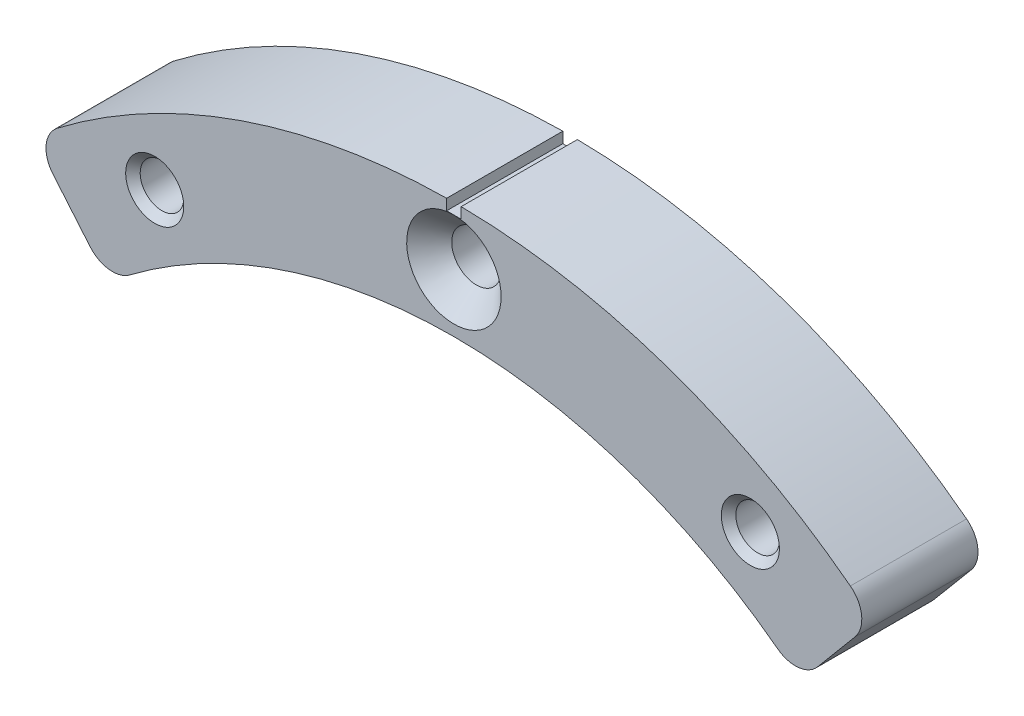
ISO-10303-21;
HEADER;
FILE_DESCRIPTION(('STEP AP214'),'2;1');
FILE_NAME('part.step','',(''),(''),'','','');
FILE_SCHEMA(('AUTOMOTIVE_DESIGN { 1 0 10303 214 1 1 1 1 }'));
ENDSEC;
DATA;
#1=APPLICATION_CONTEXT('core data for automotive mechanical design processes');
#2=APPLICATION_PROTOCOL_DEFINITION('international standard','automotive_design',2000,#1);
#3=PRODUCT_CONTEXT('',#1,'mechanical');
#4=PRODUCT('Part','Part','',(#3));
#5=PRODUCT_RELATED_PRODUCT_CATEGORY('part','',(#4));
#6=PRODUCT_DEFINITION_FORMATION('','',#4);
#7=PRODUCT_DEFINITION_CONTEXT('part definition',#1,'design');
#8=PRODUCT_DEFINITION('design','',#6,#7);
#9=PRODUCT_DEFINITION_SHAPE('','',#8);
#10=(LENGTH_UNIT() NAMED_UNIT(*) SI_UNIT(.MILLI.,.METRE.));
#11=(NAMED_UNIT(*) PLANE_ANGLE_UNIT() SI_UNIT($,.RADIAN.));
#12=(NAMED_UNIT(*) SI_UNIT($,.STERADIAN.) SOLID_ANGLE_UNIT());
#13=UNCERTAINTY_MEASURE_WITH_UNIT(LENGTH_MEASURE(1.E-05),#10,'distance_accuracy_value','');
#14=(GEOMETRIC_REPRESENTATION_CONTEXT(3) GLOBAL_UNCERTAINTY_ASSIGNED_CONTEXT((#13)) GLOBAL_UNIT_ASSIGNED_CONTEXT((#10,
#11,#12)) REPRESENTATION_CONTEXT('',''));
#15=CARTESIAN_POINT('',(0.,0.,0.));
#16=DIRECTION('',(0.,0.,1.));
#17=DIRECTION('',(1.,0.,0.));
#18=AXIS2_PLACEMENT_3D('',#15,#16,#17);
#19=CARTESIAN_POINT('',(0.,0.,8.));
#20=DIRECTION('',(0.,0.,-1.));
#21=DIRECTION('',(-1.,0.,0.));
#22=AXIS2_PLACEMENT_3D('',#19,#20,#21);
#23=CYLINDRICAL_SURFACE('',#22,45.);
#24=CARTESIAN_POINT('',(0.,0.,0.));
#25=DIRECTION('',(0.,0.,1.));
#26=DIRECTION('',(-1.,0.,0.));
#27=AXIS2_PLACEMENT_3D('',#24,#25,#26);
#28=CIRCLE('',#27,45.);
#29=CARTESIAN_POINT('',(27.2907890009069,35.780061985804,0.));
#30=VERTEX_POINT('',#29);
#31=CARTESIAN_POINT('',(0.499999999999999,44.9972221364831,0.));
#32=VERTEX_POINT('',#31);
#33=EDGE_CURVE('E224',#30,#32,#28,.T.);
#34=ORIENTED_EDGE('',*,*,#33,.T.);
#35=DIRECTION('',(0.,0.,-1.));
#36=VECTOR('',#35,1.);
#37=CARTESIAN_POINT('',(0.499999999999999,44.9972221364831,8.));
#38=LINE('',#37,#36);
#39=CARTESIAN_POINT('',(0.499999999999999,44.9972221364831,8.));
#40=VERTEX_POINT('',#39);
#41=EDGE_CURVE('E150',#32,#40,#38,.F.);
#42=ORIENTED_EDGE('',*,*,#41,.T.);
#43=CARTESIAN_POINT('',(0.,0.,8.));
#44=DIRECTION('',(0.,0.,1.));
#45=DIRECTION('',(-1.,0.,0.));
#46=AXIS2_PLACEMENT_3D('',#43,#44,#45);
#47=CIRCLE('',#46,45.);
#48=CARTESIAN_POINT('',(27.2907890009069,35.780061985804,8.));
#49=VERTEX_POINT('',#48);
#50=EDGE_CURVE('E206',#49,#40,#47,.T.);
#51=ORIENTED_EDGE('',*,*,#50,.F.);
#52=DIRECTION('',(0.,0.,-1.));
#53=VECTOR('',#52,1.);
#54=CARTESIAN_POINT('',(27.2907890009069,35.780061985804,8.));
#55=LINE('',#54,#53);
#56=EDGE_CURVE('E271',#49,#30,#55,.T.);
#57=ORIENTED_EDGE('',*,*,#56,.T.);
#58=EDGE_LOOP('',(#34,#42,#51,#57));
#59=FACE_BOUND('',#58,.T.);
#60=ADVANCED_FACE('F42',(#59),#23,.T.);
#61=CARTESIAN_POINT('',(0.,0.,8.));
#62=DIRECTION('',(0.,0.,-1.));
#63=DIRECTION('',(-1.,0.,0.));
#64=AXIS2_PLACEMENT_3D('',#61,#62,#63);
#65=CYLINDRICAL_SURFACE('',#64,37.);
#66=CARTESIAN_POINT('',(0.,0.,8.));
#67=DIRECTION('',(0.,0.,-1.));
#68=DIRECTION('',(-1.,0.,0.));
#69=AXIS2_PLACEMENT_3D('',#66,#67,#68);
#70=CIRCLE('',#69,37.);
#71=CARTESIAN_POINT('',(-22.2983277121293,29.5259983953547,8.));
#72=VERTEX_POINT('',#71);
#73=CARTESIAN_POINT('',(22.2983277121295,29.5259983953545,8.));
#74=VERTEX_POINT('',#73);
#75=EDGE_CURVE('E197',#72,#74,#70,.T.);
#76=ORIENTED_EDGE('',*,*,#75,.F.);
#77=DIRECTION('',(0.,0.,-1.));
#78=VECTOR('',#77,1.);
#79=CARTESIAN_POINT('',(-22.2983277121293,29.5259983953547,8.));
#80=LINE('',#79,#78);
#81=CARTESIAN_POINT('',(-22.2983277121293,29.5259983953547,0.));
#82=VERTEX_POINT('',#81);
#83=EDGE_CURVE('E235',#72,#82,#80,.T.);
#84=ORIENTED_EDGE('',*,*,#83,.T.);
#85=CARTESIAN_POINT('',(0.,0.,0.));
#86=DIRECTION('',(0.,0.,-1.));
#87=DIRECTION('',(-1.,0.,0.));
#88=AXIS2_PLACEMENT_3D('',#85,#86,#87);
#89=CIRCLE('',#88,37.);
#90=CARTESIAN_POINT('',(22.2983277121295,29.5259983953545,0.));
#91=VERTEX_POINT('',#90);
#92=EDGE_CURVE('E215',#82,#91,#89,.T.);
#93=ORIENTED_EDGE('',*,*,#92,.T.);
#94=DIRECTION('',(0.,0.,-1.));
#95=VECTOR('',#94,1.);
#96=CARTESIAN_POINT('',(22.2983277121295,29.5259983953545,8.));
#97=LINE('',#96,#95);
#98=EDGE_CURVE('E214',#91,#74,#97,.F.);
#99=ORIENTED_EDGE('',*,*,#98,.T.);
#100=EDGE_LOOP('',(#76,#84,#93,#99));
#101=FACE_BOUND('',#100,.T.);
#102=ADVANCED_FACE('F316',(#101),#65,.F.);
#103=CARTESIAN_POINT('',(23.783141558402,28.3436443954022,8.));
#104=DIRECTION('',(-0.766044443118977,0.64278760968654,0.));
#105=DIRECTION('',(-0.642787609686541,-0.766044443118977,0.));
#106=AXIS2_PLACEMENT_3D('',#103,#104,#105);
#107=PLANE('',#106);
#108=DIRECTION('',(0.642787609686541,0.766044443118977,0.));
#109=VECTOR('',#108,1.);
#110=CARTESIAN_POINT('',(23.783141558402,28.3436443954022,0.));
#111=LINE('',#110,#109);
#112=CARTESIAN_POINT('',(25.0357316098339,29.8364230892439,0.));
#113=VERTEX_POINT('',#112);
#114=CARTESIAN_POINT('',(27.609953931549,32.9042617892841,0.));
#115=VERTEX_POINT('',#114);
#116=EDGE_CURVE('E219',#113,#115,#111,.T.);
#117=ORIENTED_EDGE('',*,*,#116,.T.);
#118=DIRECTION('',(0.,0.,-1.));
#119=VECTOR('',#118,1.);
#120=CARTESIAN_POINT('',(27.609953931549,32.9042617892841,8.));
#121=LINE('',#120,#119);
#122=CARTESIAN_POINT('',(27.609953931549,32.9042617892841,8.));
#123=VERTEX_POINT('',#122);
#124=EDGE_CURVE('E282',#115,#123,#121,.F.);
#125=ORIENTED_EDGE('',*,*,#124,.T.);
#126=DIRECTION('',(0.642787609686541,0.766044443118977,0.));
#127=VECTOR('',#126,1.);
#128=CARTESIAN_POINT('',(23.783141558402,28.3436443954022,8.));
#129=LINE('',#128,#127);
#130=CARTESIAN_POINT('',(25.0357316098339,29.8364230892439,8.));
#131=VERTEX_POINT('',#130);
#132=EDGE_CURVE('E201',#131,#123,#129,.T.);
#133=ORIENTED_EDGE('',*,*,#132,.F.);
#134=DIRECTION('',(0.,0.,-1.));
#135=VECTOR('',#134,1.);
#136=CARTESIAN_POINT('',(25.0357316098339,29.8364230892439,8.));
#137=LINE('',#136,#135);
#138=EDGE_CURVE('E278',#131,#113,#137,.T.);
#139=ORIENTED_EDGE('',*,*,#138,.T.);
#140=EDGE_LOOP('',(#117,#125,#133,#139));
#141=FACE_BOUND('',#140,.T.);
#142=ADVANCED_FACE('F323',(#141),#107,.F.);
#143=CARTESIAN_POINT('',(-0.500000000000001,44.9972221364831,8.));
#144=VERTEX_POINT('',#143);
#145=CARTESIAN_POINT('',(-27.2907890009067,35.7800619858042,8.));
#146=VERTEX_POINT('',#145);
#147=EDGE_CURVE('E67',#144,#146,#47,.T.);
#148=ORIENTED_EDGE('',*,*,#147,.F.);
#149=DIRECTION('',(0.,0.,-1.));
#150=VECTOR('',#149,1.);
#151=CARTESIAN_POINT('',(-0.500000000000001,44.9972221364831,8.));
#152=LINE('',#151,#150);
#153=CARTESIAN_POINT('',(-0.500000000000001,44.9972221364831,0.));
#154=VERTEX_POINT('',#153);
#155=EDGE_CURVE('E143',#144,#154,#152,.T.);
#156=ORIENTED_EDGE('',*,*,#155,.T.);
#157=CARTESIAN_POINT('',(-27.2907890009067,35.7800619858042,0.));
#158=VERTEX_POINT('',#157);
#159=EDGE_CURVE('E223',#154,#158,#28,.T.);
#160=ORIENTED_EDGE('',*,*,#159,.T.);
#161=DIRECTION('',(0.,0.,-1.));
#162=VECTOR('',#161,1.);
#163=CARTESIAN_POINT('',(-27.2907890009067,35.7800619858042,8.));
#164=LINE('',#163,#162);
#165=EDGE_CURVE('E275',#158,#146,#164,.F.);
#166=ORIENTED_EDGE('',*,*,#165,.T.);
#167=EDGE_LOOP('',(#148,#156,#160,#166));
#168=FACE_BOUND('',#167,.T.);
#169=ADVANCED_FACE('F319',(#168),#23,.T.);
#170=CARTESIAN_POINT('',(-28.9254424358941,34.4719999403542,8.));
#171=DIRECTION('',(0.766044443118982,0.642787609686535,0.));
#172=DIRECTION('',(-0.642787609686535,0.766044443118982,0.));
#173=AXIS2_PLACEMENT_3D('',#170,#171,#172);
#174=PLANE('',#173);
#175=DIRECTION('',(0.642787609686535,-0.766044443118982,0.));
#176=VECTOR('',#175,1.);
#177=CARTESIAN_POINT('',(-28.9254424358941,34.4719999403542,0.));
#178=LINE('',#177,#176);
#179=CARTESIAN_POINT('',(-27.6099539315488,32.9042617892843,0.));
#180=VERTEX_POINT('',#179);
#181=CARTESIAN_POINT('',(-25.0357316098337,29.836423089244,0.));
#182=VERTEX_POINT('',#181);
#183=EDGE_CURVE('E202',#180,#182,#178,.T.);
#184=ORIENTED_EDGE('',*,*,#183,.T.);
#185=DIRECTION('',(0.,0.,-1.));
#186=VECTOR('',#185,1.);
#187=CARTESIAN_POINT('',(-25.0357316098337,29.836423089244,8.));
#188=LINE('',#187,#186);
#189=CARTESIAN_POINT('',(-25.0357316098337,29.836423089244,8.));
#190=VERTEX_POINT('',#189);
#191=EDGE_CURVE('E256',#182,#190,#188,.F.);
#192=ORIENTED_EDGE('',*,*,#191,.T.);
#193=DIRECTION('',(0.642787609686535,-0.766044443118982,0.));
#194=VECTOR('',#193,1.);
#195=CARTESIAN_POINT('',(-28.9254424358941,34.4719999403542,8.));
#196=LINE('',#195,#194);
#197=CARTESIAN_POINT('',(-27.6099539315488,32.9042617892843,8.));
#198=VERTEX_POINT('',#197);
#199=EDGE_CURVE('E210',#198,#190,#196,.T.);
#200=ORIENTED_EDGE('',*,*,#199,.F.);
#201=DIRECTION('',(0.,0.,-1.));
#202=VECTOR('',#201,1.);
#203=CARTESIAN_POINT('',(-27.6099539315488,32.9042617892843,8.));
#204=LINE('',#203,#202);
#205=EDGE_CURVE('E252',#198,#180,#204,.T.);
#206=ORIENTED_EDGE('',*,*,#205,.T.);
#207=EDGE_LOOP('',(#184,#192,#200,#206));
#208=FACE_BOUND('',#207,.T.);
#209=ADVANCED_FACE('F329',(#208),#174,.F.);
#210=CARTESIAN_POINT('',(0.,0.,8.));
#211=DIRECTION('',(0.,0.,-1.));
#212=DIRECTION('',(-1.,0.,0.));
#213=AXIS2_PLACEMENT_3D('',#210,#211,#212);
#214=PLANE('',#213);
#215=CARTESIAN_POINT('',(20.4069726364171,35.5605886877105,8.));
#216=DIRECTION('',(0.,0.,-1.));
#217=DIRECTION('',(-1.,0.,0.));
#218=AXIS2_PLACEMENT_3D('',#215,#216,#217);
#219=CIRCLE('',#218,1.99999999999998);
#220=CARTESIAN_POINT('',(18.4069726364172,35.5605886877105,8.));
#221=VERTEX_POINT('',#220);
#222=EDGE_CURVE('E293',#221,#221,#219,.T.);
#223=ORIENTED_EDGE('',*,*,#222,.T.);
#224=EDGE_LOOP('',(#223));
#225=FACE_BOUND('',#224,.T.);
#226=CARTESIAN_POINT('',(-20.5928868588783,35.4532510613263,8.));
#227=DIRECTION('',(0.,0.,-1.));
#228=DIRECTION('',(-1.,0.,0.));
#229=AXIS2_PLACEMENT_3D('',#226,#227,#228);
#230=CIRCLE('',#229,1.99999999999997);
#231=CARTESIAN_POINT('',(-22.5928868588783,35.4532510613263,8.));
#232=VERTEX_POINT('',#231);
#233=EDGE_CURVE('E289',#232,#232,#230,.T.);
#234=ORIENTED_EDGE('',*,*,#233,.T.);
#235=EDGE_LOOP('',(#234));
#236=FACE_BOUND('',#235,.T.);
#237=ORIENTED_EDGE('',*,*,#50,.T.);
#238=DIRECTION('',(0.,1.,0.));
#239=VECTOR('',#238,1.);
#240=CARTESIAN_POINT('',(0.499999999999999,45.75,8.));
#241=LINE('',#240,#239);
#242=CARTESIAN_POINT('',(0.499999999999999,44.25,8.));
#243=VERTEX_POINT('',#242);
#244=EDGE_CURVE('E167',#243,#40,#241,.T.);
#245=ORIENTED_EDGE('',*,*,#244,.F.);
#246=DIRECTION('',(1.,0.,0.));
#247=VECTOR('',#246,1.);
#248=CARTESIAN_POINT('',(-0.500000000000001,44.25,8.));
#249=LINE('',#248,#247);
#250=CARTESIAN_POINT('',(0.,44.25,8.));
#251=VERTEX_POINT('',#250);
#252=EDGE_CURVE('E139',#251,#243,#249,.T.);
#253=ORIENTED_EDGE('',*,*,#252,.F.);
#254=CARTESIAN_POINT('',(0.,41.,8.));
#255=DIRECTION('',(0.,0.,1.));
#256=DIRECTION('',(1.,0.,0.));
#257=AXIS2_PLACEMENT_3D('',#254,#255,#256);
#258=CIRCLE('',#257,3.25);
#259=EDGE_CURVE('E188',#251,#251,#258,.T.);
#260=ORIENTED_EDGE('',*,*,#259,.F.);
#261=CARTESIAN_POINT('',(-0.500000000000001,44.25,8.));
#262=VERTEX_POINT('',#261);
#263=EDGE_CURVE('E155',#262,#251,#249,.T.);
#264=ORIENTED_EDGE('',*,*,#263,.F.);
#265=DIRECTION('',(0.,-1.,0.));
#266=VECTOR('',#265,1.);
#267=CARTESIAN_POINT('',(-0.500000000000001,45.75,8.));
#268=LINE('',#267,#266);
#269=EDGE_CURVE('E170',#144,#262,#268,.T.);
#270=ORIENTED_EDGE('',*,*,#269,.F.);
#271=ORIENTED_EDGE('',*,*,#147,.T.);
#272=CARTESIAN_POINT('',(-26.0778650453108,34.1898370086573,8.));
#273=DIRECTION('',(0.,0.,-1.));
#274=DIRECTION('',(-1.,0.,0.));
#275=AXIS2_PLACEMENT_3D('',#272,#273,#274);
#276=CIRCLE('',#275,2.);
#277=EDGE_CURVE('E265',#146,#198,#276,.F.);
#278=ORIENTED_EDGE('',*,*,#277,.T.);
#279=ORIENTED_EDGE('',*,*,#199,.T.);
#280=CARTESIAN_POINT('',(-23.5036427235957,31.1219983086171,8.));
#281=DIRECTION('',(0.,0.,-1.));
#282=DIRECTION('',(-1.,0.,0.));
#283=AXIS2_PLACEMENT_3D('',#280,#281,#282);
#284=CIRCLE('',#283,2.);
#285=EDGE_CURVE('E268',#190,#72,#284,.F.);
#286=ORIENTED_EDGE('',*,*,#285,.T.);
#287=ORIENTED_EDGE('',*,*,#75,.T.);
#288=CARTESIAN_POINT('',(23.5036427235959,31.1219983086169,8.));
#289=DIRECTION('',(0.,0.,-1.));
#290=DIRECTION('',(-1.,0.,0.));
#291=AXIS2_PLACEMENT_3D('',#288,#289,#290);
#292=CIRCLE('',#291,2.);
#293=EDGE_CURVE('E259',#74,#131,#292,.F.);
#294=ORIENTED_EDGE('',*,*,#293,.T.);
#295=ORIENTED_EDGE('',*,*,#132,.T.);
#296=CARTESIAN_POINT('',(26.0778650453111,34.1898370086572,8.));
#297=DIRECTION('',(0.,0.,-1.));
#298=DIRECTION('',(-1.,0.,0.));
#299=AXIS2_PLACEMENT_3D('',#296,#297,#298);
#300=CIRCLE('',#299,2.);
#301=EDGE_CURVE('E262',#123,#49,#300,.F.);
#302=ORIENTED_EDGE('',*,*,#301,.T.);
#303=EDGE_LOOP('',(#237,#245,#253,#260,#264,#270,#271,#278,#279,#286,#287,#294,#295,#302));
#304=FACE_BOUND('',#303,.T.);
#305=ADVANCED_FACE('F335',(#225,#236,#304),#214,.F.);
#306=CARTESIAN_POINT('',(0.,0.,0.));
#307=DIRECTION('',(0.,0.,-1.));
#308=DIRECTION('',(-1.,0.,0.));
#309=AXIS2_PLACEMENT_3D('',#306,#307,#308);
#310=PLANE('',#309);
#311=DIRECTION('',(0.,1.,0.));
#312=VECTOR('',#311,1.);
#313=CARTESIAN_POINT('',(0.499999999999999,45.75,0.));
#314=LINE('',#313,#312);
#315=CARTESIAN_POINT('',(0.499999999999999,44.25,0.));
#316=VERTEX_POINT('',#315);
#317=EDGE_CURVE('E147',#316,#32,#314,.T.);
#318=ORIENTED_EDGE('',*,*,#317,.T.);
#319=ORIENTED_EDGE('',*,*,#33,.F.);
#320=CARTESIAN_POINT('',(26.0778650453111,34.1898370086572,0.));
#321=DIRECTION('',(0.,0.,-1.));
#322=DIRECTION('',(-1.,0.,0.));
#323=AXIS2_PLACEMENT_3D('',#320,#321,#322);
#324=CIRCLE('',#323,2.);
#325=EDGE_CURVE('E242',#30,#115,#324,.T.);
#326=ORIENTED_EDGE('',*,*,#325,.T.);
#327=ORIENTED_EDGE('',*,*,#116,.F.);
#328=CARTESIAN_POINT('',(23.5036427235959,31.1219983086169,0.));
#329=DIRECTION('',(0.,0.,-1.));
#330=DIRECTION('',(-1.,0.,0.));
#331=AXIS2_PLACEMENT_3D('',#328,#329,#330);
#332=CIRCLE('',#331,2.);
#333=EDGE_CURVE('E239',#113,#91,#332,.T.);
#334=ORIENTED_EDGE('',*,*,#333,.T.);
#335=ORIENTED_EDGE('',*,*,#92,.F.);
#336=CARTESIAN_POINT('',(-23.5036427235957,31.1219983086171,0.));
#337=DIRECTION('',(0.,0.,-1.));
#338=DIRECTION('',(-1.,0.,0.));
#339=AXIS2_PLACEMENT_3D('',#336,#337,#338);
#340=CIRCLE('',#339,2.);
#341=EDGE_CURVE('E249',#82,#182,#340,.T.);
#342=ORIENTED_EDGE('',*,*,#341,.T.);
#343=ORIENTED_EDGE('',*,*,#183,.F.);
#344=CARTESIAN_POINT('',(-26.0778650453108,34.1898370086573,0.));
#345=DIRECTION('',(0.,0.,-1.));
#346=DIRECTION('',(-1.,0.,0.));
#347=AXIS2_PLACEMENT_3D('',#344,#345,#346);
#348=CIRCLE('',#347,2.);
#349=EDGE_CURVE('E245',#180,#158,#348,.T.);
#350=ORIENTED_EDGE('',*,*,#349,.T.);
#351=ORIENTED_EDGE('',*,*,#159,.F.);
#352=DIRECTION('',(0.,1.,0.));
#353=VECTOR('',#352,1.);
#354=CARTESIAN_POINT('',(-0.499999999999995,0.,0.));
#355=LINE('',#354,#353);
#356=CARTESIAN_POINT('',(-0.500000000000001,44.25,0.));
#357=VERTEX_POINT('',#356);
#358=EDGE_CURVE('E11',#357,#154,#355,.T.);
#359=ORIENTED_EDGE('',*,*,#358,.F.);
#360=DIRECTION('',(1.,0.,0.));
#361=VECTOR('',#360,1.);
#362=CARTESIAN_POINT('',(-0.500000000000001,44.25,0.));
#363=LINE('',#362,#361);
#364=EDGE_CURVE('E59',#357,#316,#363,.T.);
#365=ORIENTED_EDGE('',*,*,#364,.T.);
#366=EDGE_LOOP('',(#318,#319,#326,#327,#334,#335,#342,#343,#350,#351,#359,#365));
#367=FACE_BOUND('',#366,.T.);
#368=CARTESIAN_POINT('',(-20.5928868588783,35.4532510613263,0.));
#369=DIRECTION('',(0.,0.,1.));
#370=DIRECTION('',(1.,0.,0.));
#371=AXIS2_PLACEMENT_3D('',#368,#369,#370);
#372=CIRCLE('',#371,1.49999999999999);
#373=CARTESIAN_POINT('',(-19.0928868588783,35.4532510613263,0.));
#374=VERTEX_POINT('',#373);
#375=EDGE_CURVE('E180',#374,#374,#372,.T.);
#376=ORIENTED_EDGE('',*,*,#375,.T.);
#377=EDGE_LOOP('',(#376));
#378=FACE_BOUND('',#377,.T.);
#379=CARTESIAN_POINT('',(20.4069726364171,35.5605886877105,0.));
#380=DIRECTION('',(0.,0.,1.));
#381=DIRECTION('',(1.,0.,0.));
#382=AXIS2_PLACEMENT_3D('',#379,#380,#381);
#383=CIRCLE('',#382,1.49999999999999);
#384=CARTESIAN_POINT('',(21.9069726364171,35.5605886877105,0.));
#385=VERTEX_POINT('',#384);
#386=EDGE_CURVE('E184',#385,#385,#383,.T.);
#387=ORIENTED_EDGE('',*,*,#386,.T.);
#388=EDGE_LOOP('',(#387));
#389=FACE_BOUND('',#388,.T.);
#390=CARTESIAN_POINT('',(0.,41.,0.));
#391=DIRECTION('',(0.,0.,-1.));
#392=DIRECTION('',(-1.,0.,0.));
#393=AXIS2_PLACEMENT_3D('',#390,#391,#392);
#394=CIRCLE('',#393,1.7);
#395=CARTESIAN_POINT('',(-1.7,41.,0.));
#396=VERTEX_POINT('',#395);
#397=EDGE_CURVE('E196',#396,#396,#394,.T.);
#398=ORIENTED_EDGE('',*,*,#397,.F.);
#399=EDGE_LOOP('',(#398));
#400=FACE_BOUND('',#399,.T.);
#401=ADVANCED_FACE('F158',(#367,#378,#389,#400),#310,.T.);
#402=CARTESIAN_POINT('',(0.,41.,8.));
#403=DIRECTION('',(0.,0.,1.));
#404=DIRECTION('',(1.,0.,0.));
#405=AXIS2_PLACEMENT_3D('',#402,#403,#404);
#406=CYLINDRICAL_SURFACE('',#405,1.7);
#407=ORIENTED_EDGE('',*,*,#397,.T.);
#408=EDGE_LOOP('',(#407));
#409=FACE_BOUND('',#408,.T.);
#410=CARTESIAN_POINT('',(0.,41.,6.45));
#411=DIRECTION('',(0.,0.,1.));
#412=DIRECTION('',(1.,0.,0.));
#413=AXIS2_PLACEMENT_3D('',#410,#411,#412);
#414=CIRCLE('',#413,1.7);
#415=CARTESIAN_POINT('',(1.7,41.,6.45));
#416=VERTEX_POINT('',#415);
#417=EDGE_CURVE('E192',#416,#416,#414,.T.);
#418=ORIENTED_EDGE('',*,*,#417,.T.);
#419=EDGE_LOOP('',(#418));
#420=FACE_BOUND('',#419,.T.);
#421=ADVANCED_FACE('F382',(#409,#420),#406,.F.);
#422=CARTESIAN_POINT('',(0.,41.,8.));
#423=DIRECTION('',(0.,0.,1.));
#424=DIRECTION('',(1.,0.,0.));
#425=AXIS2_PLACEMENT_3D('',#422,#423,#424);
#426=CONICAL_SURFACE('',#425,3.25,0.785398163397449);
#427=ORIENTED_EDGE('',*,*,#417,.F.);
#428=EDGE_LOOP('',(#427));
#429=FACE_BOUND('',#428,.T.);
#430=ORIENTED_EDGE('',*,*,#259,.T.);
#431=EDGE_LOOP('',(#430));
#432=FACE_BOUND('',#431,.T.);
#433=ADVANCED_FACE('F380',(#429,#432),#426,.F.);
#434=CARTESIAN_POINT('',(-23.5036427235957,31.1219983086171,8.));
#435=DIRECTION('',(0.,0.,-1.));
#436=DIRECTION('',(-1.,0.,0.));
#437=AXIS2_PLACEMENT_3D('',#434,#435,#436);
#438=CYLINDRICAL_SURFACE('',#437,2.);
#439=ORIENTED_EDGE('',*,*,#285,.F.);
#440=ORIENTED_EDGE('',*,*,#191,.F.);
#441=ORIENTED_EDGE('',*,*,#341,.F.);
#442=ORIENTED_EDGE('',*,*,#83,.F.);
#443=EDGE_LOOP('',(#439,#440,#441,#442));
#444=FACE_BOUND('',#443,.T.);
#445=ADVANCED_FACE('F359',(#444),#438,.T.);
#446=CARTESIAN_POINT('',(-26.0778650453108,34.1898370086573,8.));
#447=DIRECTION('',(0.,0.,-1.));
#448=DIRECTION('',(-1.,0.,0.));
#449=AXIS2_PLACEMENT_3D('',#446,#447,#448);
#450=CYLINDRICAL_SURFACE('',#449,2.);
#451=ORIENTED_EDGE('',*,*,#277,.F.);
#452=ORIENTED_EDGE('',*,*,#165,.F.);
#453=ORIENTED_EDGE('',*,*,#349,.F.);
#454=ORIENTED_EDGE('',*,*,#205,.F.);
#455=EDGE_LOOP('',(#451,#452,#453,#454));
#456=FACE_BOUND('',#455,.T.);
#457=ADVANCED_FACE('F354',(#456),#450,.T.);
#458=CARTESIAN_POINT('',(26.0778650453111,34.1898370086572,8.));
#459=DIRECTION('',(0.,0.,-1.));
#460=DIRECTION('',(-1.,0.,0.));
#461=AXIS2_PLACEMENT_3D('',#458,#459,#460);
#462=CYLINDRICAL_SURFACE('',#461,2.);
#463=ORIENTED_EDGE('',*,*,#301,.F.);
#464=ORIENTED_EDGE('',*,*,#124,.F.);
#465=ORIENTED_EDGE('',*,*,#325,.F.);
#466=ORIENTED_EDGE('',*,*,#56,.F.);
#467=EDGE_LOOP('',(#463,#464,#465,#466));
#468=FACE_BOUND('',#467,.T.);
#469=ADVANCED_FACE('F373',(#468),#462,.T.);
#470=CARTESIAN_POINT('',(23.5036427235959,31.1219983086169,8.));
#471=DIRECTION('',(0.,0.,-1.));
#472=DIRECTION('',(-1.,0.,0.));
#473=AXIS2_PLACEMENT_3D('',#470,#471,#472);
#474=CYLINDRICAL_SURFACE('',#473,2.);
#475=ORIENTED_EDGE('',*,*,#293,.F.);
#476=ORIENTED_EDGE('',*,*,#98,.F.);
#477=ORIENTED_EDGE('',*,*,#333,.F.);
#478=ORIENTED_EDGE('',*,*,#138,.F.);
#479=EDGE_LOOP('',(#475,#476,#477,#478));
#480=FACE_BOUND('',#479,.T.);
#481=ADVANCED_FACE('F366',(#480),#474,.T.);
#482=CARTESIAN_POINT('',(20.4069726364171,35.5605886877105,8.));
#483=DIRECTION('',(0.,0.,1.));
#484=DIRECTION('',(1.,0.,0.));
#485=AXIS2_PLACEMENT_3D('',#482,#483,#484);
#486=CYLINDRICAL_SURFACE('',#485,1.49999999999999);
#487=CARTESIAN_POINT('',(20.4069726364171,35.5605886877105,7.50000000000001));
#488=DIRECTION('',(0.,0.,-1.));
#489=DIRECTION('',(-1.,0.,0.));
#490=AXIS2_PLACEMENT_3D('',#487,#488,#489);
#491=CIRCLE('',#490,1.49999999999999);
#492=CARTESIAN_POINT('',(18.9069726364172,35.5605886877105,7.50000000000001));
#493=VERTEX_POINT('',#492);
#494=EDGE_CURVE('E285',#493,#493,#491,.F.);
#495=ORIENTED_EDGE('',*,*,#494,.T.);
#496=EDGE_LOOP('',(#495));
#497=FACE_BOUND('',#496,.T.);
#498=ORIENTED_EDGE('',*,*,#386,.F.);
#499=EDGE_LOOP('',(#498));
#500=FACE_BOUND('',#499,.T.);
#501=ADVANCED_FACE('F394',(#497,#500),#486,.F.);
#502=CARTESIAN_POINT('',(-20.5928868588783,35.4532510613263,8.));
#503=DIRECTION('',(0.,0.,1.));
#504=DIRECTION('',(1.,0.,0.));
#505=AXIS2_PLACEMENT_3D('',#502,#503,#504);
#506=CYLINDRICAL_SURFACE('',#505,1.49999999999999);
#507=CARTESIAN_POINT('',(-20.5928868588783,35.4532510613263,7.50000000000002));
#508=DIRECTION('',(0.,0.,-1.));
#509=DIRECTION('',(-1.,0.,0.));
#510=AXIS2_PLACEMENT_3D('',#507,#508,#509);
#511=CIRCLE('',#510,1.49999999999999);
#512=CARTESIAN_POINT('',(-22.0928868588783,35.4532510613263,7.50000000000002));
#513=VERTEX_POINT('',#512);
#514=EDGE_CURVE('E52',#513,#513,#511,.F.);
#515=ORIENTED_EDGE('',*,*,#514,.T.);
#516=EDGE_LOOP('',(#515));
#517=FACE_BOUND('',#516,.T.);
#518=ORIENTED_EDGE('',*,*,#375,.F.);
#519=EDGE_LOOP('',(#518));
#520=FACE_BOUND('',#519,.T.);
#521=ADVANCED_FACE('F301',(#517,#520),#506,.F.);
#522=CARTESIAN_POINT('',(20.4069726364171,35.5605886877105,7.50000000000001));
#523=DIRECTION('',(0.,0.,1.));
#524=DIRECTION('',(1.,0.,0.));
#525=AXIS2_PLACEMENT_3D('',#522,#523,#524);
#526=CONICAL_SURFACE('',#525,1.49999999999999,0.78539816339745);
#527=ORIENTED_EDGE('',*,*,#222,.F.);
#528=EDGE_LOOP('',(#527));
#529=FACE_BOUND('',#528,.T.);
#530=ORIENTED_EDGE('',*,*,#494,.F.);
#531=EDGE_LOOP('',(#530));
#532=FACE_BOUND('',#531,.T.);
#533=ADVANCED_FACE('F305',(#529,#532),#526,.F.);
#534=CARTESIAN_POINT('',(-20.5928868588783,35.4532510613263,7.50000000000002));
#535=DIRECTION('',(0.,0.,1.));
#536=DIRECTION('',(1.,0.,0.));
#537=AXIS2_PLACEMENT_3D('',#534,#535,#536);
#538=CONICAL_SURFACE('',#537,1.49999999999999,0.78539816339745);
#539=ORIENTED_EDGE('',*,*,#233,.F.);
#540=EDGE_LOOP('',(#539));
#541=FACE_BOUND('',#540,.T.);
#542=ORIENTED_EDGE('',*,*,#514,.F.);
#543=EDGE_LOOP('',(#542));
#544=FACE_BOUND('',#543,.T.);
#545=ADVANCED_FACE('F45',(#541,#544),#538,.F.);
#546=CARTESIAN_POINT('',(0.499999999999999,45.75,0.));
#547=DIRECTION('',(1.,0.,0.));
#548=DIRECTION('',(0.,1.,0.));
#549=AXIS2_PLACEMENT_3D('',#546,#547,#548);
#550=PLANE('',#549);
#551=ORIENTED_EDGE('',*,*,#317,.F.);
#552=DIRECTION('',(0.,0.,1.));
#553=VECTOR('',#552,1.);
#554=CARTESIAN_POINT('',(0.499999999999999,44.25,0.));
#555=LINE('',#554,#553);
#556=EDGE_CURVE('E135',#316,#243,#555,.T.);
#557=ORIENTED_EDGE('',*,*,#556,.T.);
#558=ORIENTED_EDGE('',*,*,#244,.T.);
#559=ORIENTED_EDGE('',*,*,#41,.F.);
#560=EDGE_LOOP('',(#551,#557,#558,#559));
#561=FACE_BOUND('',#560,.T.);
#562=ADVANCED_FACE('F148',(#561),#550,.F.);
#563=CARTESIAN_POINT('',(-0.500000000000001,45.75,0.));
#564=DIRECTION('',(-1.,0.,0.));
#565=DIRECTION('',(0.,-1.,0.));
#566=AXIS2_PLACEMENT_3D('',#563,#564,#565);
#567=PLANE('',#566);
#568=ORIENTED_EDGE('',*,*,#269,.T.);
#569=DIRECTION('',(0.,0.,1.));
#570=VECTOR('',#569,1.);
#571=CARTESIAN_POINT('',(-0.500000000000001,44.25,0.));
#572=LINE('',#571,#570);
#573=EDGE_CURVE('E144',#357,#262,#572,.T.);
#574=ORIENTED_EDGE('',*,*,#573,.F.);
#575=ORIENTED_EDGE('',*,*,#358,.T.);
#576=ORIENTED_EDGE('',*,*,#155,.F.);
#577=EDGE_LOOP('',(#568,#574,#575,#576));
#578=FACE_BOUND('',#577,.T.);
#579=ADVANCED_FACE('F311',(#578),#567,.F.);
#580=CARTESIAN_POINT('',(-0.500000000000001,44.25,0.));
#581=DIRECTION('',(0.,-1.,0.));
#582=DIRECTION('',(0.,0.,-1.));
#583=AXIS2_PLACEMENT_3D('',#580,#581,#582);
#584=PLANE('',#583);
#585=ORIENTED_EDGE('',*,*,#263,.T.);
#586=ORIENTED_EDGE('',*,*,#252,.T.);
#587=ORIENTED_EDGE('',*,*,#556,.F.);
#588=ORIENTED_EDGE('',*,*,#364,.F.);
#589=ORIENTED_EDGE('',*,*,#573,.T.);
#590=EDGE_LOOP('',(#585,#586,#587,#588,#589));
#591=FACE_BOUND('',#590,.T.);
#592=ADVANCED_FACE('F137',(#591),#584,.F.);
#593=CLOSED_SHELL('',(#60,#102,#142,#169,#209,#305,#401,#421,#433,#445,#457,#469,#481,#501,#521,
#533,#545,#562,#579,#592));
#594=MANIFOLD_SOLID_BREP('B2',#593);
#595=ADVANCED_BREP_SHAPE_REPRESENTATION('',(#18,#594),#14);
#596=SHAPE_DEFINITION_REPRESENTATION(#9,#595);
ENDSEC;
END-ISO-10303-21;
